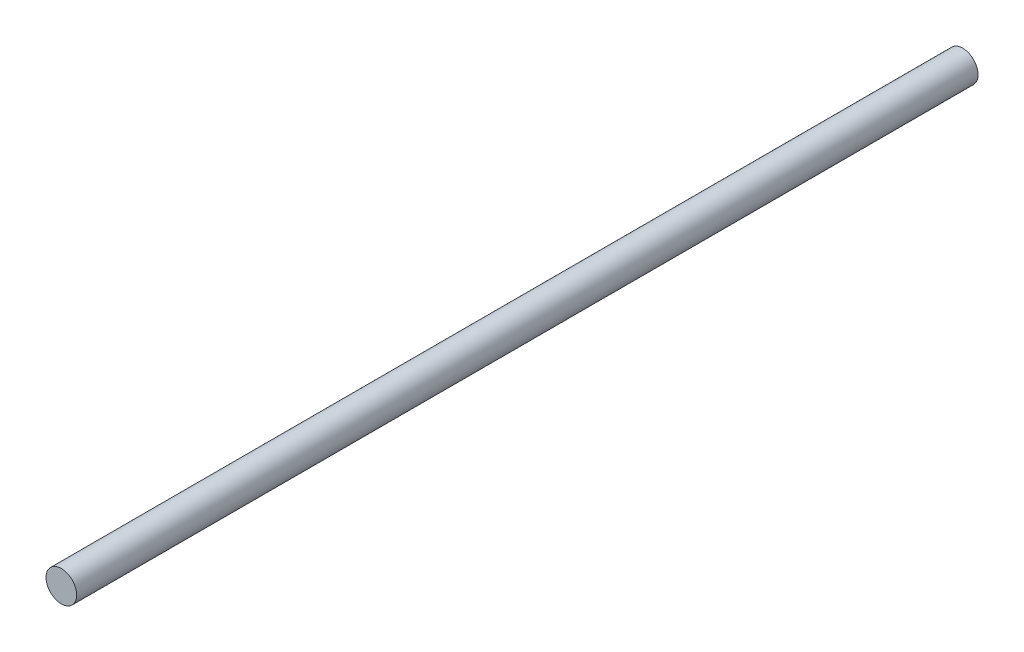
ISO-10303-21;
HEADER;
FILE_DESCRIPTION(('STEP AP214'),'2;1');
FILE_NAME('part.step','',(''),(''),'','','');
FILE_SCHEMA(('AUTOMOTIVE_DESIGN { 1 0 10303 214 1 1 1 1 }'));
ENDSEC;
DATA;
#1=APPLICATION_CONTEXT('core data for automotive mechanical design processes');
#2=APPLICATION_PROTOCOL_DEFINITION('international standard','automotive_design',2000,#1);
#3=PRODUCT_CONTEXT('',#1,'mechanical');
#4=PRODUCT('Part','Part','',(#3));
#5=PRODUCT_RELATED_PRODUCT_CATEGORY('part','',(#4));
#6=PRODUCT_DEFINITION_FORMATION('','',#4);
#7=PRODUCT_DEFINITION_CONTEXT('part definition',#1,'design');
#8=PRODUCT_DEFINITION('design','',#6,#7);
#9=PRODUCT_DEFINITION_SHAPE('','',#8);
#10=(LENGTH_UNIT() NAMED_UNIT(*) SI_UNIT(.MILLI.,.METRE.));
#11=(NAMED_UNIT(*) PLANE_ANGLE_UNIT() SI_UNIT($,.RADIAN.));
#12=(NAMED_UNIT(*) SI_UNIT($,.STERADIAN.) SOLID_ANGLE_UNIT());
#13=UNCERTAINTY_MEASURE_WITH_UNIT(LENGTH_MEASURE(1.E-05),#10,'distance_accuracy_value','');
#14=(GEOMETRIC_REPRESENTATION_CONTEXT(3) GLOBAL_UNCERTAINTY_ASSIGNED_CONTEXT((#13)) GLOBAL_UNIT_ASSIGNED_CONTEXT((#10,
#11,#12)) REPRESENTATION_CONTEXT('',''));
#15=CARTESIAN_POINT('',(0.,0.,0.));
#16=DIRECTION('',(0.,0.,1.));
#17=DIRECTION('',(1.,0.,0.));
#18=AXIS2_PLACEMENT_3D('',#15,#16,#17);
#19=CARTESIAN_POINT('',(0.,0.,235.));
#20=DIRECTION('',(0.,0.,-1.));
#21=DIRECTION('',(-1.,0.,0.));
#22=AXIS2_PLACEMENT_3D('',#19,#20,#21);
#23=CYLINDRICAL_SURFACE('',#22,4.);
#24=CARTESIAN_POINT('',(0.,0.,235.));
#25=DIRECTION('',(0.,0.,1.));
#26=DIRECTION('',(1.,0.,0.));
#27=AXIS2_PLACEMENT_3D('',#24,#25,#26);
#28=CIRCLE('',#27,4.);
#29=CARTESIAN_POINT('',(-4.,0.,235.));
#30=VERTEX_POINT('',#29);
#31=EDGE_CURVE('E10',#30,#30,#28,.T.);
#32=CARTESIAN_POINT('',(0.,0.,0.));
#33=DIRECTION('',(0.,0.,1.));
#34=DIRECTION('',(1.,0.,0.));
#35=AXIS2_PLACEMENT_3D('',#32,#33,#34);
#36=CIRCLE('',#35,4.);
#37=CARTESIAN_POINT('',(-4.,0.,0.));
#38=VERTEX_POINT('',#37);
#39=EDGE_CURVE('E34',#38,#38,#36,.T.);
#40=CARTESIAN_POINT('',(-4.,0.,235.));
#41=CARTESIAN_POINT('',(-4.,0.,232.552083333333));
#42=CARTESIAN_POINT('',(-4.,0.,230.104166666667));
#43=CARTESIAN_POINT('',(-4.,0.,225.208333333333));
#44=CARTESIAN_POINT('',(-4.,0.,222.760416666667));
#45=CARTESIAN_POINT('',(-4.,0.,217.864583333333));
#46=CARTESIAN_POINT('',(-4.,0.,215.416666666667));
#47=CARTESIAN_POINT('',(-4.,0.,210.520833333333));
#48=CARTESIAN_POINT('',(-4.,0.,208.072916666667));
#49=CARTESIAN_POINT('',(-4.,0.,203.177083333333));
#50=CARTESIAN_POINT('',(-4.,0.,200.729166666667));
#51=CARTESIAN_POINT('',(-4.,0.,195.833333333333));
#52=CARTESIAN_POINT('',(-4.,0.,193.385416666667));
#53=CARTESIAN_POINT('',(-4.,0.,188.489583333333));
#54=CARTESIAN_POINT('',(-4.,0.,186.041666666667));
#55=CARTESIAN_POINT('',(-4.,0.,181.145833333333));
#56=CARTESIAN_POINT('',(-4.,0.,178.697916666667));
#57=CARTESIAN_POINT('',(-4.,0.,173.802083333333));
#58=CARTESIAN_POINT('',(-4.,0.,171.354166666667));
#59=CARTESIAN_POINT('',(-4.,0.,166.458333333333));
#60=CARTESIAN_POINT('',(-4.,0.,164.010416666667));
#61=CARTESIAN_POINT('',(-4.,0.,159.114583333333));
#62=CARTESIAN_POINT('',(-4.,0.,156.666666666667));
#63=CARTESIAN_POINT('',(-4.,0.,151.770833333333));
#64=CARTESIAN_POINT('',(-4.,0.,149.322916666667));
#65=CARTESIAN_POINT('',(-4.,0.,144.427083333333));
#66=CARTESIAN_POINT('',(-4.,0.,141.979166666667));
#67=CARTESIAN_POINT('',(-4.,0.,137.083333333333));
#68=CARTESIAN_POINT('',(-4.,0.,134.635416666667));
#69=CARTESIAN_POINT('',(-4.,0.,129.739583333333));
#70=CARTESIAN_POINT('',(-4.,0.,127.291666666667));
#71=CARTESIAN_POINT('',(-4.,0.,122.395833333333));
#72=CARTESIAN_POINT('',(-4.,0.,119.947916666667));
#73=CARTESIAN_POINT('',(-4.,0.,115.052083333333));
#74=CARTESIAN_POINT('',(-4.,0.,112.604166666667));
#75=CARTESIAN_POINT('',(-4.,0.,107.708333333333));
#76=CARTESIAN_POINT('',(-4.,0.,105.260416666667));
#77=CARTESIAN_POINT('',(-4.,0.,100.364583333333));
#78=CARTESIAN_POINT('',(-4.,0.,97.9166666666667));
#79=CARTESIAN_POINT('',(-4.,0.,93.0208333333333));
#80=CARTESIAN_POINT('',(-4.,0.,90.5729166666667));
#81=CARTESIAN_POINT('',(-4.,0.,85.6770833333333));
#82=CARTESIAN_POINT('',(-4.,0.,83.2291666666667));
#83=CARTESIAN_POINT('',(-4.,0.,78.3333333333333));
#84=CARTESIAN_POINT('',(-4.,0.,75.8854166666667));
#85=CARTESIAN_POINT('',(-4.,0.,70.9895833333333));
#86=CARTESIAN_POINT('',(-4.,0.,68.5416666666667));
#87=CARTESIAN_POINT('',(-4.,0.,63.6458333333333));
#88=CARTESIAN_POINT('',(-4.,0.,61.1979166666667));
#89=CARTESIAN_POINT('',(-4.,0.,56.3020833333333));
#90=CARTESIAN_POINT('',(-4.,0.,53.8541666666667));
#91=CARTESIAN_POINT('',(-4.,0.,48.9583333333333));
#92=CARTESIAN_POINT('',(-4.,0.,46.5104166666667));
#93=CARTESIAN_POINT('',(-4.,0.,41.6145833333333));
#94=CARTESIAN_POINT('',(-4.,0.,39.1666666666666));
#95=CARTESIAN_POINT('',(-4.,0.,34.2708333333333));
#96=CARTESIAN_POINT('',(-4.,0.,31.8229166666666));
#97=CARTESIAN_POINT('',(-4.,0.,26.9270833333333));
#98=CARTESIAN_POINT('',(-4.,0.,24.4791666666666));
#99=CARTESIAN_POINT('',(-4.,0.,19.5833333333333));
#100=CARTESIAN_POINT('',(-4.,0.,17.1354166666666));
#101=CARTESIAN_POINT('',(-4.,0.,12.2395833333333));
#102=CARTESIAN_POINT('',(-4.,0.,9.79166666666664));
#103=CARTESIAN_POINT('',(-4.,0.,4.89583333333331));
#104=CARTESIAN_POINT('',(-4.,0.,2.44791666666664));
#105=CARTESIAN_POINT('',(-4.,0.,0.));
#106=B_SPLINE_CURVE_WITH_KNOTS('',3,(#40,#41,#42,#43,#44,#45,#46,#47,#48,#49,#50,#51,#52,#53,
#54,#55,#56,#57,#58,#59,#60,#61,#62,#63,#64,#65,#66,#67,#68,#69,#70,#71,#72,#73,#74,#75,#76,#77,
#78,#79,#80,#81,#82,#83,#84,#85,#86,#87,#88,#89,#90,#91,#92,#93,#94,#95,#96,#97,#98,#99,#100,
#101,#102,#103,#104,#105),.UNSPECIFIED.,.F.,.F.,(4,2,2,2,2,2,2,2,2,2,2,2,2,2,2,2,2,2,2,2,2,2,2,
2,2,2,2,2,2,2,2,2,4),(0.,7.34375000000001,14.6875,22.03125,29.375,36.71875,44.0625,51.40625,
58.75,66.09375,73.4375,80.78125,88.125,95.46875,102.8125,110.15625,117.5,124.84375,132.1875,
139.53125,146.875,154.21875,161.5625,168.90625,176.25,183.59375,190.9375,198.28125,205.625,
212.96875,220.3125,227.65625,235.),.UNSPECIFIED.);
#107=EDGE_CURVE('BSEAM31',#30,#38,#106,.T.);
#108=ORIENTED_EDGE('',*,*,#31,.F.);
#109=ORIENTED_EDGE('',*,*,#39,.T.);
#110=ORIENTED_EDGE('',*,*,#107,.T.);
#111=ORIENTED_EDGE('',*,*,#107,.F.);
#112=EDGE_LOOP('',(#108,#110,#109,#111));
#113=FACE_BOUND('',#112,.T.);
#114=ADVANCED_FACE('F31',(#113),#23,.T.);
#115=CARTESIAN_POINT('',(0.,0.,235.));
#116=DIRECTION('',(0.,0.,1.));
#117=DIRECTION('',(1.,0.,0.));
#118=AXIS2_PLACEMENT_3D('',#115,#116,#117);
#119=PLANE('',#118);
#120=ORIENTED_EDGE('',*,*,#31,.T.);
#121=EDGE_LOOP('',(#120));
#122=FACE_BOUND('',#121,.T.);
#123=ADVANCED_FACE('F46',(#122),#119,.T.);
#124=CARTESIAN_POINT('',(0.,0.,0.));
#125=DIRECTION('',(0.,0.,1.));
#126=DIRECTION('',(1.,0.,0.));
#127=AXIS2_PLACEMENT_3D('',#124,#125,#126);
#128=PLANE('',#127);
#129=ORIENTED_EDGE('',*,*,#39,.F.);
#130=EDGE_LOOP('',(#129));
#131=FACE_BOUND('',#130,.T.);
#132=ADVANCED_FACE('F44',(#131),#128,.F.);
#133=CLOSED_SHELL('',(#114,#123,#132));
#134=MANIFOLD_SOLID_BREP('B2',#133);
#135=ADVANCED_BREP_SHAPE_REPRESENTATION('',(#18,#134),#14);
#136=SHAPE_DEFINITION_REPRESENTATION(#9,#135);
ENDSEC;
END-ISO-10303-21;
